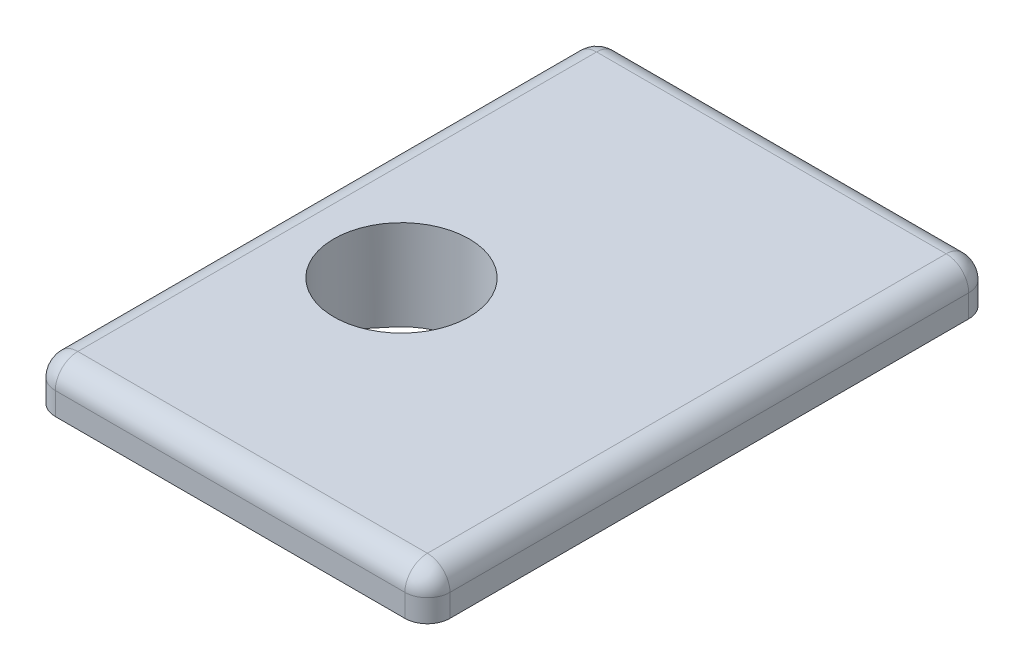
ISO-10303-21;
HEADER;
FILE_DESCRIPTION(('STEP AP214'),'2;1');
FILE_NAME('part.step','',(''),(''),'','','');
FILE_SCHEMA(('AUTOMOTIVE_DESIGN { 1 0 10303 214 1 1 1 1 }'));
ENDSEC;
DATA;
#1=APPLICATION_CONTEXT('core data for automotive mechanical design processes');
#2=APPLICATION_PROTOCOL_DEFINITION('international standard','automotive_design',2000,#1);
#3=PRODUCT_CONTEXT('',#1,'mechanical');
#4=PRODUCT('Part','Part','',(#3));
#5=PRODUCT_RELATED_PRODUCT_CATEGORY('part','',(#4));
#6=PRODUCT_DEFINITION_FORMATION('','',#4);
#7=PRODUCT_DEFINITION_CONTEXT('part definition',#1,'design');
#8=PRODUCT_DEFINITION('design','',#6,#7);
#9=PRODUCT_DEFINITION_SHAPE('','',#8);
#10=(LENGTH_UNIT() NAMED_UNIT(*) SI_UNIT(.MILLI.,.METRE.));
#11=(NAMED_UNIT(*) PLANE_ANGLE_UNIT() SI_UNIT($,.RADIAN.));
#12=(NAMED_UNIT(*) SI_UNIT($,.STERADIAN.) SOLID_ANGLE_UNIT());
#13=UNCERTAINTY_MEASURE_WITH_UNIT(LENGTH_MEASURE(1.E-05),#10,'distance_accuracy_value','');
#14=(GEOMETRIC_REPRESENTATION_CONTEXT(3) GLOBAL_UNCERTAINTY_ASSIGNED_CONTEXT((#13)) GLOBAL_UNIT_ASSIGNED_CONTEXT((#10,
#11,#12)) REPRESENTATION_CONTEXT('',''));
#15=CARTESIAN_POINT('',(0.,0.,0.));
#16=DIRECTION('',(0.,0.,1.));
#17=DIRECTION('',(1.,0.,0.));
#18=AXIS2_PLACEMENT_3D('',#15,#16,#17);
#19=CARTESIAN_POINT('',(0.,0.,0.));
#20=DIRECTION('',(0.,1.,0.));
#21=DIRECTION('',(0.,0.,-1.));
#22=AXIS2_PLACEMENT_3D('',#19,#20,#21);
#23=PLANE('',#22);
#24=DIRECTION('',(0.,0.,1.));
#25=VECTOR('',#24,1.);
#26=CARTESIAN_POINT('',(8.75,0.,-12.5));
#27=LINE('',#26,#25);
#28=CARTESIAN_POINT('',(8.75,0.,-11.5));
#29=VERTEX_POINT('',#28);
#30=CARTESIAN_POINT('',(8.75,0.,11.5));
#31=VERTEX_POINT('',#30);
#32=EDGE_CURVE('E198',#29,#31,#27,.T.);
#33=ORIENTED_EDGE('',*,*,#32,.T.);
#34=CARTESIAN_POINT('',(7.75,0.,11.5));
#35=DIRECTION('',(0.,-1.,0.));
#36=DIRECTION('',(0.,0.,-1.));
#37=AXIS2_PLACEMENT_3D('',#34,#35,#36);
#38=CIRCLE('',#37,1.);
#39=CARTESIAN_POINT('',(7.75,0.,12.5));
#40=VERTEX_POINT('',#39);
#41=EDGE_CURVE('E211',#40,#31,#38,.F.);
#42=ORIENTED_EDGE('',*,*,#41,.F.);
#43=DIRECTION('',(-1.,0.,0.));
#44=VECTOR('',#43,1.);
#45=CARTESIAN_POINT('',(8.75,0.,12.5));
#46=LINE('',#45,#44);
#47=CARTESIAN_POINT('',(-7.75,0.,12.5));
#48=VERTEX_POINT('',#47);
#49=EDGE_CURVE('E200',#40,#48,#46,.T.);
#50=ORIENTED_EDGE('',*,*,#49,.T.);
#51=CARTESIAN_POINT('',(-7.75,0.,11.5));
#52=DIRECTION('',(0.,-1.,0.));
#53=DIRECTION('',(0.,0.,-1.));
#54=AXIS2_PLACEMENT_3D('',#51,#52,#53);
#55=CIRCLE('',#54,1.);
#56=CARTESIAN_POINT('',(-8.75,0.,11.5));
#57=VERTEX_POINT('',#56);
#58=EDGE_CURVE('E214',#57,#48,#55,.F.);
#59=ORIENTED_EDGE('',*,*,#58,.F.);
#60=DIRECTION('',(0.,0.,-1.));
#61=VECTOR('',#60,1.);
#62=CARTESIAN_POINT('',(-8.75,0.,-12.5));
#63=LINE('',#62,#61);
#64=CARTESIAN_POINT('',(-8.75,0.,-11.5));
#65=VERTEX_POINT('',#64);
#66=EDGE_CURVE('E192',#57,#65,#63,.T.);
#67=ORIENTED_EDGE('',*,*,#66,.T.);
#68=CARTESIAN_POINT('',(-7.75,0.,-11.5));
#69=DIRECTION('',(0.,-1.,0.));
#70=DIRECTION('',(0.,0.,-1.));
#71=AXIS2_PLACEMENT_3D('',#68,#69,#70);
#72=CIRCLE('',#71,1.);
#73=CARTESIAN_POINT('',(-7.75,0.,-12.5));
#74=VERTEX_POINT('',#73);
#75=EDGE_CURVE('E217',#74,#65,#72,.F.);
#76=ORIENTED_EDGE('',*,*,#75,.F.);
#77=DIRECTION('',(1.,0.,0.));
#78=VECTOR('',#77,1.);
#79=CARTESIAN_POINT('',(8.75,0.,-12.5));
#80=LINE('',#79,#78);
#81=CARTESIAN_POINT('',(-6.75,0.,-12.5));
#82=VERTEX_POINT('',#81);
#83=EDGE_CURVE('E196',#74,#82,#80,.T.);
#84=ORIENTED_EDGE('',*,*,#83,.T.);
#85=DIRECTION('',(0.,0.,1.));
#86=VECTOR('',#85,1.);
#87=CARTESIAN_POINT('',(-6.75,0.,-12.5));
#88=LINE('',#87,#86);
#89=CARTESIAN_POINT('',(-6.75,0.,10.5));
#90=VERTEX_POINT('',#89);
#91=EDGE_CURVE('E183',#82,#90,#88,.T.);
#92=ORIENTED_EDGE('',*,*,#91,.T.);
#93=DIRECTION('',(1.,0.,0.));
#94=VECTOR('',#93,1.);
#95=CARTESIAN_POINT('',(-6.75,0.,10.5));
#96=LINE('',#95,#94);
#97=CARTESIAN_POINT('',(6.75,0.,10.5));
#98=VERTEX_POINT('',#97);
#99=EDGE_CURVE('E163',#90,#98,#96,.T.);
#100=ORIENTED_EDGE('',*,*,#99,.T.);
#101=DIRECTION('',(0.,0.,-1.));
#102=VECTOR('',#101,1.);
#103=CARTESIAN_POINT('',(6.75,0.,-12.5));
#104=LINE('',#103,#102);
#105=CARTESIAN_POINT('',(6.75,0.,-12.5));
#106=VERTEX_POINT('',#105);
#107=EDGE_CURVE('E172',#98,#106,#104,.T.);
#108=ORIENTED_EDGE('',*,*,#107,.T.);
#109=CARTESIAN_POINT('',(7.75,0.,-12.5));
#110=VERTEX_POINT('',#109);
#111=EDGE_CURVE('E195',#106,#110,#80,.T.);
#112=ORIENTED_EDGE('',*,*,#111,.T.);
#113=CARTESIAN_POINT('',(7.75,0.,-11.5));
#114=DIRECTION('',(0.,-1.,0.));
#115=DIRECTION('',(0.,0.,-1.));
#116=AXIS2_PLACEMENT_3D('',#113,#114,#115);
#117=CIRCLE('',#116,1.);
#118=EDGE_CURVE('E220',#29,#110,#117,.F.);
#119=ORIENTED_EDGE('',*,*,#118,.F.);
#120=EDGE_LOOP('',(#33,#42,#50,#59,#67,#76,#84,#92,#100,#108,#112,#119));
#121=FACE_BOUND('',#120,.T.);
#122=ADVANCED_FACE('F37',(#121),#23,.F.);
#123=CARTESIAN_POINT('',(-8.75,2.,-12.5));
#124=DIRECTION('',(1.,0.,0.));
#125=DIRECTION('',(0.,0.,1.));
#126=AXIS2_PLACEMENT_3D('',#123,#124,#125);
#127=PLANE('',#126);
#128=ORIENTED_EDGE('',*,*,#66,.F.);
#129=DIRECTION('',(0.,-1.,0.));
#130=VECTOR('',#129,1.);
#131=CARTESIAN_POINT('',(-8.75,2.,11.5));
#132=LINE('',#131,#130);
#133=CARTESIAN_POINT('',(-8.75,1.,11.5));
#134=VERTEX_POINT('',#133);
#135=EDGE_CURVE('E237',#134,#57,#132,.T.);
#136=ORIENTED_EDGE('',*,*,#135,.F.);
#137=DIRECTION('',(0.,0.,-1.));
#138=VECTOR('',#137,1.);
#139=CARTESIAN_POINT('',(-8.75,1.,12.5));
#140=LINE('',#139,#138);
#141=CARTESIAN_POINT('',(-8.75,1.,-11.5));
#142=VERTEX_POINT('',#141);
#143=EDGE_CURVE('E234',#142,#134,#140,.F.);
#144=ORIENTED_EDGE('',*,*,#143,.F.);
#145=DIRECTION('',(0.,-1.,0.));
#146=VECTOR('',#145,1.);
#147=CARTESIAN_POINT('',(-8.75,2.,-11.5));
#148=LINE('',#147,#146);
#149=EDGE_CURVE('E239',#65,#142,#148,.F.);
#150=ORIENTED_EDGE('',*,*,#149,.F.);
#151=EDGE_LOOP('',(#128,#136,#144,#150));
#152=FACE_BOUND('',#151,.T.);
#153=ADVANCED_FACE('F302',(#152),#127,.F.);
#154=CARTESIAN_POINT('',(8.75,2.,-12.5));
#155=DIRECTION('',(0.,0.,1.));
#156=DIRECTION('',(-1.,0.,0.));
#157=AXIS2_PLACEMENT_3D('',#154,#155,#156);
#158=PLANE('',#157);
#159=DIRECTION('',(0.,1.,0.));
#160=VECTOR('',#159,1.);
#161=CARTESIAN_POINT('',(-6.75,-2.,-12.5));
#162=LINE('',#161,#160);
#163=CARTESIAN_POINT('',(-6.75,-1.,-12.5));
#164=VERTEX_POINT('',#163);
#165=EDGE_CURVE('E178',#164,#82,#162,.T.);
#166=ORIENTED_EDGE('',*,*,#165,.T.);
#167=ORIENTED_EDGE('',*,*,#83,.F.);
#168=DIRECTION('',(0.,-1.,0.));
#169=VECTOR('',#168,1.);
#170=CARTESIAN_POINT('',(-7.75,2.,-12.5));
#171=LINE('',#170,#169);
#172=CARTESIAN_POINT('',(-7.75,1.,-12.5));
#173=VERTEX_POINT('',#172);
#174=EDGE_CURVE('E226',#173,#74,#171,.T.);
#175=ORIENTED_EDGE('',*,*,#174,.F.);
#176=DIRECTION('',(1.,0.,0.));
#177=VECTOR('',#176,1.);
#178=CARTESIAN_POINT('',(-8.75,1.,-12.5));
#179=LINE('',#178,#177);
#180=CARTESIAN_POINT('',(7.75,1.,-12.5));
#181=VERTEX_POINT('',#180);
#182=EDGE_CURVE('E223',#181,#173,#179,.F.);
#183=ORIENTED_EDGE('',*,*,#182,.F.);
#184=DIRECTION('',(0.,-1.,0.));
#185=VECTOR('',#184,1.);
#186=CARTESIAN_POINT('',(7.75,2.,-12.5));
#187=LINE('',#186,#185);
#188=EDGE_CURVE('E228',#110,#181,#187,.F.);
#189=ORIENTED_EDGE('',*,*,#188,.F.);
#190=ORIENTED_EDGE('',*,*,#111,.F.);
#191=DIRECTION('',(0.,1.,0.));
#192=VECTOR('',#191,1.);
#193=CARTESIAN_POINT('',(6.75,-2.,-12.5));
#194=LINE('',#193,#192);
#195=CARTESIAN_POINT('',(6.75,-1.,-12.5));
#196=VERTEX_POINT('',#195);
#197=EDGE_CURVE('E169',#196,#106,#194,.T.);
#198=ORIENTED_EDGE('',*,*,#197,.F.);
#199=DIRECTION('',(-1.,0.,0.));
#200=VECTOR('',#199,1.);
#201=CARTESIAN_POINT('',(6.75,-1.,-12.5));
#202=LINE('',#201,#200);
#203=EDGE_CURVE('E231',#164,#196,#202,.F.);
#204=ORIENTED_EDGE('',*,*,#203,.F.);
#205=EDGE_LOOP('',(#166,#167,#175,#183,#189,#190,#198,#204));
#206=FACE_BOUND('',#205,.T.);
#207=ADVANCED_FACE('F307',(#206),#158,.F.);
#208=CARTESIAN_POINT('',(8.75,2.,-12.5));
#209=DIRECTION('',(-1.,0.,0.));
#210=DIRECTION('',(0.,0.,-1.));
#211=AXIS2_PLACEMENT_3D('',#208,#209,#210);
#212=PLANE('',#211);
#213=DIRECTION('',(0.,0.,1.));
#214=VECTOR('',#213,1.);
#215=CARTESIAN_POINT('',(8.75,1.,-12.5));
#216=LINE('',#215,#214);
#217=CARTESIAN_POINT('',(8.75,1.,11.5));
#218=VERTEX_POINT('',#217);
#219=CARTESIAN_POINT('',(8.75,1.,-11.5));
#220=VERTEX_POINT('',#219);
#221=EDGE_CURVE('E203',#218,#220,#216,.F.);
#222=ORIENTED_EDGE('',*,*,#221,.F.);
#223=DIRECTION('',(0.,-1.,0.));
#224=VECTOR('',#223,1.);
#225=CARTESIAN_POINT('',(8.75,2.,11.5));
#226=LINE('',#225,#224);
#227=EDGE_CURVE('E206',#31,#218,#226,.F.);
#228=ORIENTED_EDGE('',*,*,#227,.F.);
#229=ORIENTED_EDGE('',*,*,#32,.F.);
#230=DIRECTION('',(0.,-1.,0.));
#231=VECTOR('',#230,1.);
#232=CARTESIAN_POINT('',(8.75,2.,-11.5));
#233=LINE('',#232,#231);
#234=EDGE_CURVE('E209',#220,#29,#233,.T.);
#235=ORIENTED_EDGE('',*,*,#234,.F.);
#236=EDGE_LOOP('',(#222,#228,#229,#235));
#237=FACE_BOUND('',#236,.T.);
#238=ADVANCED_FACE('F317',(#237),#212,.F.);
#239=CARTESIAN_POINT('',(8.75,2.,12.5));
#240=DIRECTION('',(0.,0.,-1.));
#241=DIRECTION('',(1.,0.,0.));
#242=AXIS2_PLACEMENT_3D('',#239,#240,#241);
#243=PLANE('',#242);
#244=ORIENTED_EDGE('',*,*,#49,.F.);
#245=DIRECTION('',(0.,-1.,0.));
#246=VECTOR('',#245,1.);
#247=CARTESIAN_POINT('',(7.75,2.,12.5));
#248=LINE('',#247,#246);
#249=CARTESIAN_POINT('',(7.75,1.,12.5));
#250=VERTEX_POINT('',#249);
#251=EDGE_CURVE('E245',#250,#40,#248,.T.);
#252=ORIENTED_EDGE('',*,*,#251,.F.);
#253=DIRECTION('',(-1.,0.,0.));
#254=VECTOR('',#253,1.);
#255=CARTESIAN_POINT('',(8.75,1.,12.5));
#256=LINE('',#255,#254);
#257=CARTESIAN_POINT('',(-7.75,1.,12.5));
#258=VERTEX_POINT('',#257);
#259=EDGE_CURVE('E242',#258,#250,#256,.F.);
#260=ORIENTED_EDGE('',*,*,#259,.F.);
#261=DIRECTION('',(0.,-1.,0.));
#262=VECTOR('',#261,1.);
#263=CARTESIAN_POINT('',(-7.75,2.,12.5));
#264=LINE('',#263,#262);
#265=EDGE_CURVE('E247',#48,#258,#264,.F.);
#266=ORIENTED_EDGE('',*,*,#265,.F.);
#267=EDGE_LOOP('',(#244,#252,#260,#266));
#268=FACE_BOUND('',#267,.T.);
#269=ADVANCED_FACE('F314',(#268),#243,.F.);
#270=CARTESIAN_POINT('',(0.,2.,0.));
#271=DIRECTION('',(0.,1.,0.));
#272=DIRECTION('',(0.,0.,-1.));
#273=AXIS2_PLACEMENT_3D('',#270,#271,#272);
#274=PLANE('',#273);
#275=DIRECTION('',(1.,0.,0.));
#276=VECTOR('',#275,1.);
#277=CARTESIAN_POINT('',(8.75,2.,-11.5));
#278=LINE('',#277,#276);
#279=CARTESIAN_POINT('',(-7.75,2.,-11.5));
#280=VERTEX_POINT('',#279);
#281=CARTESIAN_POINT('',(7.75,2.,-11.5));
#282=VERTEX_POINT('',#281);
#283=EDGE_CURVE('E253',#280,#282,#278,.T.);
#284=ORIENTED_EDGE('',*,*,#283,.F.);
#285=DIRECTION('',(0.,0.,-1.));
#286=VECTOR('',#285,1.);
#287=CARTESIAN_POINT('',(-7.75,2.,-12.5));
#288=LINE('',#287,#286);
#289=CARTESIAN_POINT('',(-7.75,2.,11.5));
#290=VERTEX_POINT('',#289);
#291=EDGE_CURVE('E250',#290,#280,#288,.T.);
#292=ORIENTED_EDGE('',*,*,#291,.F.);
#293=DIRECTION('',(-1.,0.,0.));
#294=VECTOR('',#293,1.);
#295=CARTESIAN_POINT('',(-8.75,2.,11.5));
#296=LINE('',#295,#294);
#297=CARTESIAN_POINT('',(7.75,2.,11.5));
#298=VERTEX_POINT('',#297);
#299=EDGE_CURVE('E256',#298,#290,#296,.T.);
#300=ORIENTED_EDGE('',*,*,#299,.F.);
#301=DIRECTION('',(0.,0.,1.));
#302=VECTOR('',#301,1.);
#303=CARTESIAN_POINT('',(7.75,2.,12.5));
#304=LINE('',#303,#302);
#305=EDGE_CURVE('E259',#282,#298,#304,.T.);
#306=ORIENTED_EDGE('',*,*,#305,.F.);
#307=EDGE_LOOP('',(#284,#292,#300,#306));
#308=FACE_BOUND('',#307,.T.);
#309=CARTESIAN_POINT('',(-3.4,2.,1.5));
#310=DIRECTION('',(0.,-1.,0.));
#311=DIRECTION('',(0.,0.,-1.));
#312=AXIS2_PLACEMENT_3D('',#309,#310,#311);
#313=CIRCLE('',#312,3.);
#314=CARTESIAN_POINT('',(-3.4,2.,-1.5));
#315=VERTEX_POINT('',#314);
#316=EDGE_CURVE('E382',#315,#315,#313,.T.);
#317=ORIENTED_EDGE('',*,*,#316,.T.);
#318=EDGE_LOOP('',(#317));
#319=FACE_BOUND('',#318,.T.);
#320=ADVANCED_FACE('F312',(#308,#319),#274,.T.);
#321=CARTESIAN_POINT('',(-6.75,-2.,-12.5));
#322=DIRECTION('',(1.,0.,0.));
#323=DIRECTION('',(0.,0.,1.));
#324=AXIS2_PLACEMENT_3D('',#321,#322,#323);
#325=PLANE('',#324);
#326=DIRECTION('',(0.,1.,0.));
#327=VECTOR('',#326,1.);
#328=CARTESIAN_POINT('',(-6.75,-2.,10.5));
#329=LINE('',#328,#327);
#330=CARTESIAN_POINT('',(-6.75,-1.,10.5));
#331=VERTEX_POINT('',#330);
#332=EDGE_CURVE('E168',#331,#90,#329,.T.);
#333=ORIENTED_EDGE('',*,*,#332,.T.);
#334=ORIENTED_EDGE('',*,*,#91,.F.);
#335=ORIENTED_EDGE('',*,*,#165,.F.);
#336=DIRECTION('',(0.,0.,1.));
#337=VECTOR('',#336,1.);
#338=CARTESIAN_POINT('',(-6.75,-1.,-12.5));
#339=LINE('',#338,#337);
#340=EDGE_CURVE('E11',#331,#164,#339,.F.);
#341=ORIENTED_EDGE('',*,*,#340,.F.);
#342=EDGE_LOOP('',(#333,#334,#335,#341));
#343=FACE_BOUND('',#342,.T.);
#344=ADVANCED_FACE('F438',(#343),#325,.F.);
#345=CARTESIAN_POINT('',(-6.75,-2.,10.5));
#346=DIRECTION('',(0.,0.,-1.));
#347=DIRECTION('',(1.,0.,0.));
#348=AXIS2_PLACEMENT_3D('',#345,#346,#347);
#349=PLANE('',#348);
#350=DIRECTION('',(0.,1.,0.));
#351=VECTOR('',#350,1.);
#352=CARTESIAN_POINT('',(6.75,-2.,10.5));
#353=LINE('',#352,#351);
#354=CARTESIAN_POINT('',(6.75,-1.,10.5));
#355=VERTEX_POINT('',#354);
#356=EDGE_CURVE('E158',#355,#98,#353,.T.);
#357=ORIENTED_EDGE('',*,*,#356,.T.);
#358=ORIENTED_EDGE('',*,*,#99,.F.);
#359=ORIENTED_EDGE('',*,*,#332,.F.);
#360=DIRECTION('',(1.,0.,0.));
#361=VECTOR('',#360,1.);
#362=CARTESIAN_POINT('',(-6.75,-1.,10.5));
#363=LINE('',#362,#361);
#364=EDGE_CURVE('E165',#355,#331,#363,.F.);
#365=ORIENTED_EDGE('',*,*,#364,.F.);
#366=EDGE_LOOP('',(#357,#358,#359,#365));
#367=FACE_BOUND('',#366,.T.);
#368=ADVANCED_FACE('F160',(#367),#349,.F.);
#369=CARTESIAN_POINT('',(6.75,-2.,-12.5));
#370=DIRECTION('',(-1.,0.,0.));
#371=DIRECTION('',(0.,0.,-1.));
#372=AXIS2_PLACEMENT_3D('',#369,#370,#371);
#373=PLANE('',#372);
#374=ORIENTED_EDGE('',*,*,#197,.T.);
#375=ORIENTED_EDGE('',*,*,#107,.F.);
#376=ORIENTED_EDGE('',*,*,#356,.F.);
#377=DIRECTION('',(0.,0.,-1.));
#378=VECTOR('',#377,1.);
#379=CARTESIAN_POINT('',(6.75,-1.,10.5));
#380=LINE('',#379,#378);
#381=EDGE_CURVE('E275',#196,#355,#380,.F.);
#382=ORIENTED_EDGE('',*,*,#381,.F.);
#383=EDGE_LOOP('',(#374,#375,#376,#382));
#384=FACE_BOUND('',#383,.T.);
#385=ADVANCED_FACE('F173',(#384),#373,.F.);
#386=CARTESIAN_POINT('',(0.,-2.,0.));
#387=DIRECTION('',(0.,-1.,0.));
#388=DIRECTION('',(0.,0.,1.));
#389=AXIS2_PLACEMENT_3D('',#386,#387,#388);
#390=PLANE('',#389);
#391=DIRECTION('',(-1.,0.,0.));
#392=VECTOR('',#391,1.);
#393=CARTESIAN_POINT('',(-6.75,-2.,-11.5));
#394=LINE('',#393,#392);
#395=CARTESIAN_POINT('',(5.75,-2.,-11.5));
#396=VERTEX_POINT('',#395);
#397=CARTESIAN_POINT('',(-5.75,-2.,-11.5));
#398=VERTEX_POINT('',#397);
#399=EDGE_CURVE('E269',#396,#398,#394,.T.);
#400=ORIENTED_EDGE('',*,*,#399,.F.);
#401=DIRECTION('',(0.,0.,-1.));
#402=VECTOR('',#401,1.);
#403=CARTESIAN_POINT('',(5.75,-2.,-12.5));
#404=LINE('',#403,#402);
#405=CARTESIAN_POINT('',(5.75,-2.,9.5));
#406=VERTEX_POINT('',#405);
#407=EDGE_CURVE('E266',#406,#396,#404,.T.);
#408=ORIENTED_EDGE('',*,*,#407,.F.);
#409=DIRECTION('',(1.,0.,0.));
#410=VECTOR('',#409,1.);
#411=CARTESIAN_POINT('',(6.75,-2.,9.5));
#412=LINE('',#411,#410);
#413=CARTESIAN_POINT('',(-5.75,-2.,9.5));
#414=VERTEX_POINT('',#413);
#415=EDGE_CURVE('E264',#414,#406,#412,.T.);
#416=ORIENTED_EDGE('',*,*,#415,.F.);
#417=DIRECTION('',(0.,0.,1.));
#418=VECTOR('',#417,1.);
#419=CARTESIAN_POINT('',(-5.75,-2.,10.5));
#420=LINE('',#419,#418);
#421=CARTESIAN_POINT('',(-5.75,-2.,3.36480561989715));
#422=VERTEX_POINT('',#421);
#423=EDGE_CURVE('E262',#422,#414,#420,.T.);
#424=ORIENTED_EDGE('',*,*,#423,.F.);
#425=CARTESIAN_POINT('',(-3.4,-2.,1.5));
#426=DIRECTION('',(0.,-1.,0.));
#427=DIRECTION('',(0.,0.,-1.));
#428=AXIS2_PLACEMENT_3D('',#425,#426,#427);
#429=CIRCLE('',#428,3.);
#430=CARTESIAN_POINT('',(-5.75,-2.,-0.364805619897152));
#431=VERTEX_POINT('',#430);
#432=EDGE_CURVE('E185',#431,#422,#429,.T.);
#433=ORIENTED_EDGE('',*,*,#432,.F.);
#434=DIRECTION('',(0.,0.,1.));
#435=VECTOR('',#434,1.);
#436=CARTESIAN_POINT('',(-5.75,-2.,10.5));
#437=LINE('',#436,#435);
#438=EDGE_CURVE('E272',#398,#431,#437,.T.);
#439=ORIENTED_EDGE('',*,*,#438,.F.);
#440=EDGE_LOOP('',(#400,#408,#416,#424,#433,#439));
#441=FACE_BOUND('',#440,.T.);
#442=ADVANCED_FACE('F373',(#441),#390,.T.);
#443=CARTESIAN_POINT('',(-3.4,-2.,1.5));
#444=DIRECTION('',(0.,1.,0.));
#445=DIRECTION('',(0.,0.,-1.));
#446=AXIS2_PLACEMENT_3D('',#443,#444,#445);
#447=CYLINDRICAL_SURFACE('',#446,3.);
#448=ORIENTED_EDGE('',*,*,#432,.T.);
#449=CARTESIAN_POINT('',(-5.75,-2.,-0.364805619897152));
#450=CARTESIAN_POINT('',(-5.79058341217266,-1.99997818609951,-0.313676248787291));
#451=CARTESIAN_POINT('',(-5.82943860459693,-1.9975324059022,-0.261271666719793));
#452=CARTESIAN_POINT('',(-5.90346320425669,-1.98886048486312,-0.154351235606765));
#453=CARTESIAN_POINT('',(-5.93863928737256,-1.98264133553194,-0.0998394653562877));
#454=CARTESIAN_POINT('',(-6.00519307322158,-1.96749015818174,0.0109903857378262));
#455=CARTESIAN_POINT('',(-6.03657465821087,-1.95856093632415,0.0673065445202496));
#456=CARTESIAN_POINT('',(-6.09554804876906,-1.93891656966115,0.18160868108987));
#457=CARTESIAN_POINT('',(-6.1231378607593,-1.92820049189395,0.239595518027339));
#458=CARTESIAN_POINT('',(-6.20404168789704,-1.89300880210018,0.424649849088152));
#459=CARTESIAN_POINT('',(-6.25045191696274,-1.86688147691726,0.554474051875947));
#460=CARTESIAN_POINT('',(-6.32515958597009,-1.81925606872627,0.820006977501257));
#461=CARTESIAN_POINT('',(-6.35348021555517,-1.79775208247896,0.955707927353126));
#462=CARTESIAN_POINT('',(-6.38145532415626,-1.77549476775111,1.16018403162407));
#463=CARTESIAN_POINT('',(-6.3883616613674,-1.76975788176162,1.2274536889015));
#464=CARTESIAN_POINT('',(-6.39761217339541,-1.76199643768404,1.36252527403571));
#465=CARTESIAN_POINT('',(-6.39995707636017,-1.75997128708959,1.43032711520398));
#466=CARTESIAN_POINT('',(-6.40004177907708,-1.75989810708435,1.56596663020606));
#467=CARTESIAN_POINT('',(-6.39777940689467,-1.76185195342892,1.63380430586113));
#468=CARTESIAN_POINT('',(-6.38868690667658,-1.76948877402626,1.76896247192916));
#469=CARTESIAN_POINT('',(-6.38185593812801,-1.77517243447234,1.83628286486877));
#470=CARTESIAN_POINT('',(-6.36173114674026,-1.79119204058007,1.98468779283817));
#471=CARTESIAN_POINT('',(-6.34734626953865,-1.80227630354667,2.06554284147219));
#472=CARTESIAN_POINT('',(-6.31212503513019,-1.8273329417671,2.22542425570821));
#473=CARTESIAN_POINT('',(-6.2912828649946,-1.8413079154892,2.30444890439548));
#474=CARTESIAN_POINT('',(-6.24328880667758,-1.87031746878253,2.4603988913546));
#475=CARTESIAN_POINT('',(-6.21613386613852,-1.88535255848419,2.53732319389398));
#476=CARTESIAN_POINT('',(-6.15562129885461,-1.91465936759314,2.68878200992613));
#477=CARTESIAN_POINT('',(-6.12226695674279,-1.92893148611362,2.76331776453963));
#478=CARTESIAN_POINT('',(-6.03959349675117,-1.9584076436565,2.92943637694656));
#479=CARTESIAN_POINT('',(-5.98839043898837,-1.97283997621857,3.02024673506312));
#480=CARTESIAN_POINT('',(-5.9043460950356,-1.98842751210758,3.1525688804358));
#481=CARTESIAN_POINT('',(-5.87511608481122,-1.99261349864662,3.19603823570508));
#482=CARTESIAN_POINT('',(-5.81429820938558,-1.9983968523661,3.281551141194));
#483=CARTESIAN_POINT('',(-5.78270739624779,-1.99999092455884,3.32359281012198));
#484=CARTESIAN_POINT('',(-5.75,-2.,3.36480561989715));
#485=B_SPLINE_CURVE_WITH_KNOTS('',3,(#449,#450,#451,#452,#453,#454,#455,#456,#457,#458,#459,
#460,#461,#462,#463,#464,#465,#466,#467,#468,#469,#470,#471,#472,#473,#474,#475,#476,#477,#478,
#479,#480,#481,#482,#483,#484),.UNSPECIFIED.,.F.,.F.,(4,2,2,2,2,2,2,2,2,2,2,2,2,2,2,2,2,4),(0.,
0.195647171577345,0.390932939411952,0.586017183291404,0.781203606283623,1.20084972563709,
1.61995680162277,1.82333311480929,2.02667696009577,2.23011668673222,2.43359385173059,
2.68182688865366,2.93028404028906,3.17886157698817,3.42730778319571,3.74220356137133,
3.89973397029668,4.05746448463137),.UNSPECIFIED.);
#486=EDGE_CURVE('E46',#431,#422,#485,.T.);
#487=ORIENTED_EDGE('',*,*,#486,.F.);
#488=EDGE_LOOP('',(#448,#487));
#489=FACE_BOUND('',#488,.T.);
#490=ORIENTED_EDGE('',*,*,#316,.F.);
#491=EDGE_LOOP('',(#490));
#492=FACE_BOUND('',#491,.T.);
#493=ADVANCED_FACE('F285',(#489,#492),#447,.F.);
#494=CARTESIAN_POINT('',(-7.75,2.,11.5));
#495=DIRECTION('',(0.,-1.,0.));
#496=DIRECTION('',(0.,0.,1.));
#497=AXIS2_PLACEMENT_3D('',#494,#495,#496);
#498=CYLINDRICAL_SURFACE('',#497,1.);
#499=CARTESIAN_POINT('',(-7.75,1.,11.5));
#500=DIRECTION('',(0.,-1.,0.));
#501=DIRECTION('',(0.,0.,-1.));
#502=AXIS2_PLACEMENT_3D('',#499,#500,#501);
#503=CIRCLE('',#502,1.);
#504=EDGE_CURVE('E377',#258,#134,#503,.T.);
#505=ORIENTED_EDGE('',*,*,#504,.T.);
#506=ORIENTED_EDGE('',*,*,#135,.T.);
#507=ORIENTED_EDGE('',*,*,#58,.T.);
#508=ORIENTED_EDGE('',*,*,#265,.T.);
#509=EDGE_LOOP('',(#505,#506,#507,#508));
#510=FACE_BOUND('',#509,.T.);
#511=ADVANCED_FACE('F366',(#510),#498,.T.);
#512=CARTESIAN_POINT('',(-7.75,1.,11.5));
#513=DIRECTION('',(0.,0.,-1.));
#514=DIRECTION('',(1.,0.,0.));
#515=AXIS2_PLACEMENT_3D('',#512,#513,#514);
#516=SPHERICAL_SURFACE('',#515,1.);
#517=CARTESIAN_POINT('',(-7.75,1.,11.5));
#518=DIRECTION('',(1.,0.,0.));
#519=DIRECTION('',(0.,0.,-1.));
#520=AXIS2_PLACEMENT_3D('',#517,#518,#519);
#521=CIRCLE('',#520,1.);
#522=EDGE_CURVE('E397',#258,#290,#521,.F.);
#523=ORIENTED_EDGE('',*,*,#522,.T.);
#524=CARTESIAN_POINT('',(-7.75,1.,11.5));
#525=DIRECTION('',(0.,0.,-1.));
#526=DIRECTION('',(-1.,0.,0.));
#527=AXIS2_PLACEMENT_3D('',#524,#525,#526);
#528=CIRCLE('',#527,1.);
#529=EDGE_CURVE('E383',#290,#134,#528,.F.);
#530=ORIENTED_EDGE('',*,*,#529,.T.);
#531=ORIENTED_EDGE('',*,*,#504,.F.);
#532=EDGE_LOOP('',(#523,#530,#531));
#533=FACE_BOUND('',#532,.T.);
#534=ADVANCED_FACE('F363',(#533),#516,.T.);
#535=CARTESIAN_POINT('',(-7.75,2.,-11.5));
#536=DIRECTION('',(0.,-1.,0.));
#537=DIRECTION('',(0.,0.,1.));
#538=AXIS2_PLACEMENT_3D('',#535,#536,#537);
#539=CYLINDRICAL_SURFACE('',#538,1.);
#540=ORIENTED_EDGE('',*,*,#75,.T.);
#541=ORIENTED_EDGE('',*,*,#149,.T.);
#542=CARTESIAN_POINT('',(-7.75,1.,-11.5));
#543=DIRECTION('',(0.,-1.,0.));
#544=DIRECTION('',(0.,0.,-1.));
#545=AXIS2_PLACEMENT_3D('',#542,#543,#544);
#546=CIRCLE('',#545,1.);
#547=EDGE_CURVE('E400',#142,#173,#546,.T.);
#548=ORIENTED_EDGE('',*,*,#547,.T.);
#549=ORIENTED_EDGE('',*,*,#174,.T.);
#550=EDGE_LOOP('',(#540,#541,#548,#549));
#551=FACE_BOUND('',#550,.T.);
#552=ADVANCED_FACE('F359',(#551),#539,.T.);
#553=CARTESIAN_POINT('',(-7.75,1.,0.));
#554=DIRECTION('',(0.,0.,1.));
#555=DIRECTION('',(-1.,0.,0.));
#556=AXIS2_PLACEMENT_3D('',#553,#554,#555);
#557=CYLINDRICAL_SURFACE('',#556,1.);
#558=ORIENTED_EDGE('',*,*,#529,.F.);
#559=ORIENTED_EDGE('',*,*,#291,.T.);
#560=CARTESIAN_POINT('',(-7.75,1.,-11.5));
#561=DIRECTION('',(0.,0.,1.));
#562=DIRECTION('',(1.,0.,0.));
#563=AXIS2_PLACEMENT_3D('',#560,#561,#562);
#564=CIRCLE('',#563,1.);
#565=EDGE_CURVE('E387',#280,#142,#564,.T.);
#566=ORIENTED_EDGE('',*,*,#565,.T.);
#567=ORIENTED_EDGE('',*,*,#143,.T.);
#568=EDGE_LOOP('',(#558,#559,#566,#567));
#569=FACE_BOUND('',#568,.T.);
#570=ADVANCED_FACE('F355',(#569),#557,.T.);
#571=CARTESIAN_POINT('',(0.,1.,11.5));
#572=DIRECTION('',(1.,0.,0.));
#573=DIRECTION('',(0.,0.,1.));
#574=AXIS2_PLACEMENT_3D('',#571,#572,#573);
#575=CYLINDRICAL_SURFACE('',#574,1.);
#576=ORIENTED_EDGE('',*,*,#522,.F.);
#577=ORIENTED_EDGE('',*,*,#259,.T.);
#578=CARTESIAN_POINT('',(7.75,1.,11.5));
#579=DIRECTION('',(-1.,0.,0.));
#580=DIRECTION('',(0.,0.,1.));
#581=AXIS2_PLACEMENT_3D('',#578,#579,#580);
#582=CIRCLE('',#581,1.);
#583=EDGE_CURVE('E396',#250,#298,#582,.T.);
#584=ORIENTED_EDGE('',*,*,#583,.T.);
#585=ORIENTED_EDGE('',*,*,#299,.T.);
#586=EDGE_LOOP('',(#576,#577,#584,#585));
#587=FACE_BOUND('',#586,.T.);
#588=ADVANCED_FACE('F351',(#587),#575,.T.);
#589=CARTESIAN_POINT('',(7.75,2.,11.5));
#590=DIRECTION('',(0.,-1.,0.));
#591=DIRECTION('',(0.,0.,1.));
#592=AXIS2_PLACEMENT_3D('',#589,#590,#591);
#593=CYLINDRICAL_SURFACE('',#592,1.);
#594=ORIENTED_EDGE('',*,*,#41,.T.);
#595=ORIENTED_EDGE('',*,*,#227,.T.);
#596=CARTESIAN_POINT('',(7.75,1.,11.5));
#597=DIRECTION('',(0.,-1.,0.));
#598=DIRECTION('',(0.,0.,-1.));
#599=AXIS2_PLACEMENT_3D('',#596,#597,#598);
#600=CIRCLE('',#599,1.);
#601=EDGE_CURVE('E423',#218,#250,#600,.T.);
#602=ORIENTED_EDGE('',*,*,#601,.T.);
#603=ORIENTED_EDGE('',*,*,#251,.T.);
#604=EDGE_LOOP('',(#594,#595,#602,#603));
#605=FACE_BOUND('',#604,.T.);
#606=ADVANCED_FACE('F347',(#605),#593,.T.);
#607=CARTESIAN_POINT('',(-7.75,1.,-11.5));
#608=DIRECTION('',(0.,0.,-1.));
#609=DIRECTION('',(1.,0.,0.));
#610=AXIS2_PLACEMENT_3D('',#607,#608,#609);
#611=SPHERICAL_SURFACE('',#610,1.);
#612=ORIENTED_EDGE('',*,*,#565,.F.);
#613=CARTESIAN_POINT('',(-7.75,1.,-11.5));
#614=DIRECTION('',(1.,0.,0.));
#615=DIRECTION('',(0.,-1.,0.));
#616=AXIS2_PLACEMENT_3D('',#613,#614,#615);
#617=CIRCLE('',#616,1.);
#618=EDGE_CURVE('E421',#280,#173,#617,.F.);
#619=ORIENTED_EDGE('',*,*,#618,.T.);
#620=ORIENTED_EDGE('',*,*,#547,.F.);
#621=EDGE_LOOP('',(#612,#619,#620));
#622=FACE_BOUND('',#621,.T.);
#623=ADVANCED_FACE('F343',(#622),#611,.T.);
#624=CARTESIAN_POINT('',(7.75,1.,11.5));
#625=DIRECTION('',(0.,0.,-1.));
#626=DIRECTION('',(1.,0.,0.));
#627=AXIS2_PLACEMENT_3D('',#624,#625,#626);
#628=SPHERICAL_SURFACE('',#627,1.);
#629=ORIENTED_EDGE('',*,*,#601,.F.);
#630=CARTESIAN_POINT('',(7.75,1.,11.5));
#631=DIRECTION('',(0.,0.,-1.));
#632=DIRECTION('',(-1.,0.,0.));
#633=AXIS2_PLACEMENT_3D('',#630,#631,#632);
#634=CIRCLE('',#633,1.);
#635=EDGE_CURVE('E419',#218,#298,#634,.F.);
#636=ORIENTED_EDGE('',*,*,#635,.T.);
#637=ORIENTED_EDGE('',*,*,#583,.F.);
#638=EDGE_LOOP('',(#629,#636,#637));
#639=FACE_BOUND('',#638,.T.);
#640=ADVANCED_FACE('F339',(#639),#628,.T.);
#641=CARTESIAN_POINT('',(0.,1.,-11.5));
#642=DIRECTION('',(-1.,0.,0.));
#643=DIRECTION('',(0.,0.,-1.));
#644=AXIS2_PLACEMENT_3D('',#641,#642,#643);
#645=CYLINDRICAL_SURFACE('',#644,1.);
#646=ORIENTED_EDGE('',*,*,#618,.F.);
#647=ORIENTED_EDGE('',*,*,#283,.T.);
#648=CARTESIAN_POINT('',(7.75,1.,-11.5));
#649=DIRECTION('',(-1.,0.,0.));
#650=DIRECTION('',(0.,0.,1.));
#651=AXIS2_PLACEMENT_3D('',#648,#649,#650);
#652=CIRCLE('',#651,1.);
#653=EDGE_CURVE('E415',#282,#181,#652,.T.);
#654=ORIENTED_EDGE('',*,*,#653,.T.);
#655=ORIENTED_EDGE('',*,*,#182,.T.);
#656=EDGE_LOOP('',(#646,#647,#654,#655));
#657=FACE_BOUND('',#656,.T.);
#658=ADVANCED_FACE('F335',(#657),#645,.T.);
#659=CARTESIAN_POINT('',(7.75,1.,0.));
#660=DIRECTION('',(0.,0.,-1.));
#661=DIRECTION('',(1.,0.,0.));
#662=AXIS2_PLACEMENT_3D('',#659,#660,#661);
#663=CYLINDRICAL_SURFACE('',#662,1.);
#664=ORIENTED_EDGE('',*,*,#635,.F.);
#665=ORIENTED_EDGE('',*,*,#221,.T.);
#666=CARTESIAN_POINT('',(7.75,1.,-11.5));
#667=DIRECTION('',(0.,0.,1.));
#668=DIRECTION('',(1.,0.,0.));
#669=AXIS2_PLACEMENT_3D('',#666,#667,#668);
#670=CIRCLE('',#669,1.);
#671=EDGE_CURVE('E411',#220,#282,#670,.T.);
#672=ORIENTED_EDGE('',*,*,#671,.T.);
#673=ORIENTED_EDGE('',*,*,#305,.T.);
#674=EDGE_LOOP('',(#664,#665,#672,#673));
#675=FACE_BOUND('',#674,.T.);
#676=ADVANCED_FACE('F331',(#675),#663,.T.);
#677=CARTESIAN_POINT('',(7.75,1.,-11.5));
#678=DIRECTION('',(0.,0.,-1.));
#679=DIRECTION('',(1.,0.,0.));
#680=AXIS2_PLACEMENT_3D('',#677,#678,#679);
#681=SPHERICAL_SURFACE('',#680,1.);
#682=ORIENTED_EDGE('',*,*,#671,.F.);
#683=CARTESIAN_POINT('',(7.75,1.,-11.5));
#684=DIRECTION('',(0.,-1.,0.));
#685=DIRECTION('',(0.,0.,-1.));
#686=AXIS2_PLACEMENT_3D('',#683,#684,#685);
#687=CIRCLE('',#686,1.);
#688=EDGE_CURVE('E410',#220,#181,#687,.F.);
#689=ORIENTED_EDGE('',*,*,#688,.T.);
#690=ORIENTED_EDGE('',*,*,#653,.F.);
#691=EDGE_LOOP('',(#682,#689,#690));
#692=FACE_BOUND('',#691,.T.);
#693=ADVANCED_FACE('F327',(#692),#681,.T.);
#694=CARTESIAN_POINT('',(7.75,2.,-11.5));
#695=DIRECTION('',(0.,-1.,0.));
#696=DIRECTION('',(0.,0.,1.));
#697=AXIS2_PLACEMENT_3D('',#694,#695,#696);
#698=CYLINDRICAL_SURFACE('',#697,1.);
#699=ORIENTED_EDGE('',*,*,#688,.F.);
#700=ORIENTED_EDGE('',*,*,#234,.T.);
#701=ORIENTED_EDGE('',*,*,#118,.T.);
#702=ORIENTED_EDGE('',*,*,#188,.T.);
#703=EDGE_LOOP('',(#699,#700,#701,#702));
#704=FACE_BOUND('',#703,.T.);
#705=ADVANCED_FACE('F300',(#704),#698,.T.);
#706=CARTESIAN_POINT('',(0.,-1.,9.5));
#707=DIRECTION('',(-1.,0.,0.));
#708=DIRECTION('',(0.,0.,-1.));
#709=AXIS2_PLACEMENT_3D('',#706,#707,#708);
#710=CYLINDRICAL_SURFACE('',#709,1.);
#711=CARTESIAN_POINT('',(-5.75,-1.,9.5));
#712=DIRECTION('',(0.707106781186548,0.,0.707106781186547));
#713=DIRECTION('',(0.707106781186547,0.,-0.707106781186548));
#714=AXIS2_PLACEMENT_3D('',#711,#712,#713);
#715=ELLIPSE('',#714,1.41421356237309,1.);
#716=EDGE_CURVE('E53',#331,#414,#715,.T.);
#717=ORIENTED_EDGE('',*,*,#716,.T.);
#718=ORIENTED_EDGE('',*,*,#415,.T.);
#719=CARTESIAN_POINT('',(5.75,-1.,9.5));
#720=DIRECTION('',(0.707106781186547,0.,-0.707106781186548));
#721=DIRECTION('',(-0.707106781186548,0.,-0.707106781186547));
#722=AXIS2_PLACEMENT_3D('',#719,#720,#721);
#723=ELLIPSE('',#722,1.4142135623731,1.);
#724=EDGE_CURVE('E41',#406,#355,#723,.F.);
#725=ORIENTED_EDGE('',*,*,#724,.T.);
#726=ORIENTED_EDGE('',*,*,#364,.T.);
#727=EDGE_LOOP('',(#717,#718,#725,#726));
#728=FACE_BOUND('',#727,.T.);
#729=ADVANCED_FACE('F39',(#728),#710,.T.);
#730=CARTESIAN_POINT('',(5.75,-1.,0.));
#731=DIRECTION('',(0.,0.,1.));
#732=DIRECTION('',(-1.,0.,0.));
#733=AXIS2_PLACEMENT_3D('',#730,#731,#732);
#734=CYLINDRICAL_SURFACE('',#733,1.);
#735=ORIENTED_EDGE('',*,*,#724,.F.);
#736=ORIENTED_EDGE('',*,*,#407,.T.);
#737=CARTESIAN_POINT('',(5.75,-1.,-11.5));
#738=DIRECTION('',(-0.707106781186548,0.,-0.707106781186547));
#739=DIRECTION('',(-0.707106781186547,0.,0.707106781186547));
#740=AXIS2_PLACEMENT_3D('',#737,#738,#739);
#741=ELLIPSE('',#740,1.41421356237309,1.);
#742=EDGE_CURVE('E409',#396,#196,#741,.F.);
#743=ORIENTED_EDGE('',*,*,#742,.T.);
#744=ORIENTED_EDGE('',*,*,#381,.T.);
#745=EDGE_LOOP('',(#735,#736,#743,#744));
#746=FACE_BOUND('',#745,.T.);
#747=ADVANCED_FACE('F293',(#746),#734,.T.);
#748=CARTESIAN_POINT('',(-5.75,-1.,0.));
#749=DIRECTION('',(0.,0.,-1.));
#750=DIRECTION('',(1.,0.,0.));
#751=AXIS2_PLACEMENT_3D('',#748,#749,#750);
#752=CYLINDRICAL_SURFACE('',#751,1.);
#753=ORIENTED_EDGE('',*,*,#486,.T.);
#754=ORIENTED_EDGE('',*,*,#423,.T.);
#755=ORIENTED_EDGE('',*,*,#716,.F.);
#756=ORIENTED_EDGE('',*,*,#340,.T.);
#757=CARTESIAN_POINT('',(-5.75,-1.,-11.5));
#758=DIRECTION('',(-0.707106781186547,0.,0.707106781186547));
#759=DIRECTION('',(-0.707106781186548,0.,-0.707106781186547));
#760=AXIS2_PLACEMENT_3D('',#757,#758,#759);
#761=ELLIPSE('',#760,1.4142135623731,1.);
#762=EDGE_CURVE('E407',#164,#398,#761,.T.);
#763=ORIENTED_EDGE('',*,*,#762,.T.);
#764=ORIENTED_EDGE('',*,*,#438,.T.);
#765=EDGE_LOOP('',(#753,#754,#755,#756,#763,#764));
#766=FACE_BOUND('',#765,.T.);
#767=ADVANCED_FACE('F288',(#766),#752,.T.);
#768=CARTESIAN_POINT('',(0.,-1.,-11.5));
#769=DIRECTION('',(1.,0.,0.));
#770=DIRECTION('',(0.,0.,1.));
#771=AXIS2_PLACEMENT_3D('',#768,#769,#770);
#772=CYLINDRICAL_SURFACE('',#771,1.);
#773=ORIENTED_EDGE('',*,*,#742,.F.);
#774=ORIENTED_EDGE('',*,*,#399,.T.);
#775=ORIENTED_EDGE('',*,*,#762,.F.);
#776=ORIENTED_EDGE('',*,*,#203,.T.);
#777=EDGE_LOOP('',(#773,#774,#775,#776));
#778=FACE_BOUND('',#777,.T.);
#779=ADVANCED_FACE('F292',(#778),#772,.T.);
#780=CLOSED_SHELL('',(#122,#153,#207,#238,#269,#320,#344,#368,#385,#442,#493,#511,#534,#552,
#570,#588,#606,#623,#640,#658,#676,#693,#705,#729,#747,#767,#779));
#781=MANIFOLD_SOLID_BREP('B2',#780);
#782=ADVANCED_BREP_SHAPE_REPRESENTATION('',(#18,#781),#14);
#783=SHAPE_DEFINITION_REPRESENTATION(#9,#782);
ENDSEC;
END-ISO-10303-21;
